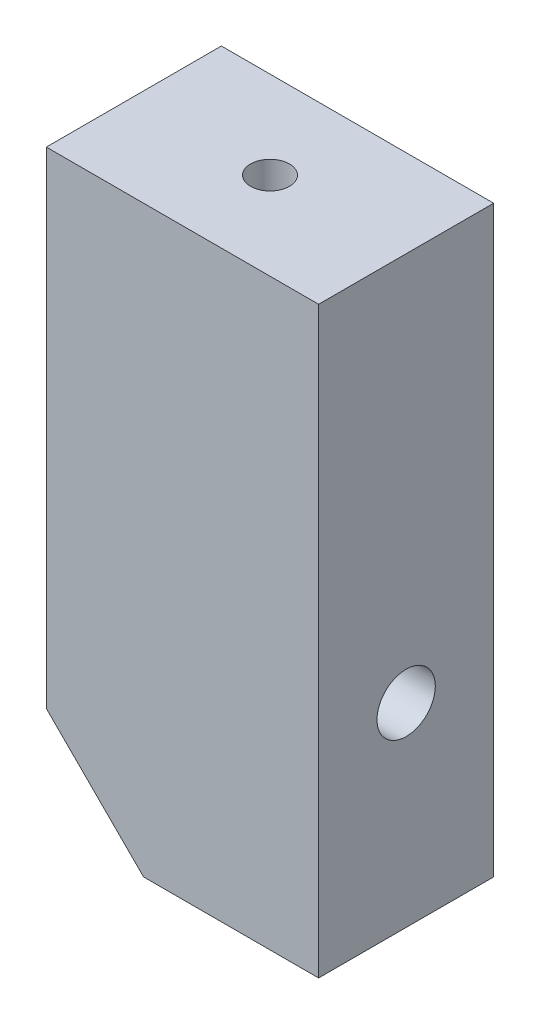
ISO-10303-21;
HEADER;
FILE_DESCRIPTION(('STEP AP214'),'2;1');
FILE_NAME('part.step','',(''),(''),'','','');
FILE_SCHEMA(('AUTOMOTIVE_DESIGN { 1 0 10303 214 1 1 1 1 }'));
ENDSEC;
DATA;
#1=APPLICATION_CONTEXT('core data for automotive mechanical design processes');
#2=APPLICATION_PROTOCOL_DEFINITION('international standard','automotive_design',2000,#1);
#3=PRODUCT_CONTEXT('',#1,'mechanical');
#4=PRODUCT('Part','Part','',(#3));
#5=PRODUCT_RELATED_PRODUCT_CATEGORY('part','',(#4));
#6=PRODUCT_DEFINITION_FORMATION('','',#4);
#7=PRODUCT_DEFINITION_CONTEXT('part definition',#1,'design');
#8=PRODUCT_DEFINITION('design','',#6,#7);
#9=PRODUCT_DEFINITION_SHAPE('','',#8);
#10=(LENGTH_UNIT() NAMED_UNIT(*) SI_UNIT(.MILLI.,.METRE.));
#11=(NAMED_UNIT(*) PLANE_ANGLE_UNIT() SI_UNIT($,.RADIAN.));
#12=(NAMED_UNIT(*) SI_UNIT($,.STERADIAN.) SOLID_ANGLE_UNIT());
#13=UNCERTAINTY_MEASURE_WITH_UNIT(LENGTH_MEASURE(1.E-05),#10,'distance_accuracy_value','');
#14=(GEOMETRIC_REPRESENTATION_CONTEXT(3) GLOBAL_UNCERTAINTY_ASSIGNED_CONTEXT((#13)) GLOBAL_UNIT_ASSIGNED_CONTEXT((#10,
#11,#12)) REPRESENTATION_CONTEXT('',''));
#15=CARTESIAN_POINT('',(0.,0.,0.));
#16=DIRECTION('',(0.,0.,1.));
#17=DIRECTION('',(1.,0.,0.));
#18=AXIS2_PLACEMENT_3D('',#15,#16,#17);
#19=CARTESIAN_POINT('',(14.,30.,18.));
#20=DIRECTION('',(-1.,0.,0.));
#21=DIRECTION('',(0.,-1.,0.));
#22=AXIS2_PLACEMENT_3D('',#19,#20,#21);
#23=PLANE('',#22);
#24=CARTESIAN_POINT('',(14.,-10.0000000000001,9.00000000000004));
#25=DIRECTION('',(1.,0.,0.));
#26=DIRECTION('',(0.,0.,-1.));
#27=AXIS2_PLACEMENT_3D('',#24,#25,#26);
#28=CIRCLE('',#27,3.);
#29=CARTESIAN_POINT('',(14.,-10.0000000000001,6.00000000000004));
#30=VERTEX_POINT('',#29);
#31=EDGE_CURVE('E179',#30,#30,#28,.T.);
#32=ORIENTED_EDGE('',*,*,#31,.F.);
#33=EDGE_LOOP('',(#32));
#34=FACE_BOUND('',#33,.T.);
#35=DIRECTION('',(0.,1.,0.));
#36=VECTOR('',#35,1.);
#37=CARTESIAN_POINT('',(14.,30.,0.));
#38=LINE('',#37,#36);
#39=CARTESIAN_POINT('',(14.,-30.,0.));
#40=VERTEX_POINT('',#39);
#41=CARTESIAN_POINT('',(14.,30.,0.));
#42=VERTEX_POINT('',#41);
#43=EDGE_CURVE('E90',#40,#42,#38,.T.);
#44=ORIENTED_EDGE('',*,*,#43,.T.);
#45=DIRECTION('',(0.,0.,-1.));
#46=VECTOR('',#45,1.);
#47=CARTESIAN_POINT('',(14.,30.,18.));
#48=LINE('',#47,#46);
#49=CARTESIAN_POINT('',(14.,30.,18.));
#50=VERTEX_POINT('',#49);
#51=EDGE_CURVE('E121',#50,#42,#48,.T.);
#52=ORIENTED_EDGE('',*,*,#51,.F.);
#53=DIRECTION('',(0.,1.,0.));
#54=VECTOR('',#53,1.);
#55=CARTESIAN_POINT('',(14.,30.,18.));
#56=LINE('',#55,#54);
#57=CARTESIAN_POINT('',(14.,-30.,18.));
#58=VERTEX_POINT('',#57);
#59=EDGE_CURVE('E101',#58,#50,#56,.T.);
#60=ORIENTED_EDGE('',*,*,#59,.F.);
#61=DIRECTION('',(0.,0.,-1.));
#62=VECTOR('',#61,1.);
#63=CARTESIAN_POINT('',(14.,-30.,18.));
#64=LINE('',#63,#62);
#65=EDGE_CURVE('E110',#58,#40,#64,.T.);
#66=ORIENTED_EDGE('',*,*,#65,.T.);
#67=EDGE_LOOP('',(#44,#52,#60,#66));
#68=FACE_BOUND('',#67,.T.);
#69=ADVANCED_FACE('F33',(#34,#68),#23,.F.);
#70=CARTESIAN_POINT('',(-14.,30.,18.));
#71=DIRECTION('',(0.,-1.,0.));
#72=DIRECTION('',(0.,0.,-1.));
#73=AXIS2_PLACEMENT_3D('',#70,#71,#72);
#74=PLANE('',#73);
#75=CARTESIAN_POINT('',(0.,30.,8.99999999999997));
#76=DIRECTION('',(0.,1.,0.));
#77=DIRECTION('',(0.,0.,1.));
#78=AXIS2_PLACEMENT_3D('',#75,#76,#77);
#79=CIRCLE('',#78,1.99999999999999);
#80=CARTESIAN_POINT('',(0.,30.,11.));
#81=VERTEX_POINT('',#80);
#82=EDGE_CURVE('E91',#81,#81,#79,.T.);
#83=ORIENTED_EDGE('',*,*,#82,.F.);
#84=EDGE_LOOP('',(#83));
#85=FACE_BOUND('',#84,.T.);
#86=DIRECTION('',(-1.,0.,0.));
#87=VECTOR('',#86,1.);
#88=CARTESIAN_POINT('',(-14.,30.,0.));
#89=LINE('',#88,#87);
#90=CARTESIAN_POINT('',(-14.,30.,0.));
#91=VERTEX_POINT('',#90);
#92=EDGE_CURVE('E94',#42,#91,#89,.T.);
#93=ORIENTED_EDGE('',*,*,#92,.T.);
#94=DIRECTION('',(0.,0.,-1.));
#95=VECTOR('',#94,1.);
#96=CARTESIAN_POINT('',(-14.,30.,18.));
#97=LINE('',#96,#95);
#98=CARTESIAN_POINT('',(-14.,30.,18.));
#99=VERTEX_POINT('',#98);
#100=EDGE_CURVE('E118',#99,#91,#97,.T.);
#101=ORIENTED_EDGE('',*,*,#100,.F.);
#102=DIRECTION('',(-1.,0.,0.));
#103=VECTOR('',#102,1.);
#104=CARTESIAN_POINT('',(-14.,30.,18.));
#105=LINE('',#104,#103);
#106=EDGE_CURVE('E104',#50,#99,#105,.T.);
#107=ORIENTED_EDGE('',*,*,#106,.F.);
#108=ORIENTED_EDGE('',*,*,#51,.T.);
#109=EDGE_LOOP('',(#93,#101,#107,#108));
#110=FACE_BOUND('',#109,.T.);
#111=ADVANCED_FACE('F148',(#85,#110),#74,.F.);
#112=CARTESIAN_POINT('',(-14.,30.,18.));
#113=DIRECTION('',(1.,0.,0.));
#114=DIRECTION('',(0.,1.,0.));
#115=AXIS2_PLACEMENT_3D('',#112,#113,#114);
#116=PLANE('',#115);
#117=DIRECTION('',(0.,-1.,0.));
#118=VECTOR('',#117,1.);
#119=CARTESIAN_POINT('',(-14.,30.,0.));
#120=LINE('',#119,#118);
#121=CARTESIAN_POINT('',(-14.,-20.,0.));
#122=VERTEX_POINT('',#121);
#123=EDGE_CURVE('E113',#91,#122,#120,.T.);
#124=ORIENTED_EDGE('',*,*,#123,.T.);
#125=DIRECTION('',(0.,0.,1.));
#126=VECTOR('',#125,1.);
#127=CARTESIAN_POINT('',(-14.,-20.,18.));
#128=LINE('',#127,#126);
#129=CARTESIAN_POINT('',(-14.,-20.,18.));
#130=VERTEX_POINT('',#129);
#131=EDGE_CURVE('E41',#122,#130,#128,.T.);
#132=ORIENTED_EDGE('',*,*,#131,.T.);
#133=DIRECTION('',(0.,-1.,0.));
#134=VECTOR('',#133,1.);
#135=CARTESIAN_POINT('',(-14.,30.,18.));
#136=LINE('',#135,#134);
#137=EDGE_CURVE('E107',#99,#130,#136,.T.);
#138=ORIENTED_EDGE('',*,*,#137,.F.);
#139=ORIENTED_EDGE('',*,*,#100,.T.);
#140=EDGE_LOOP('',(#124,#132,#138,#139));
#141=FACE_BOUND('',#140,.T.);
#142=ADVANCED_FACE('F153',(#141),#116,.F.);
#143=CARTESIAN_POINT('',(-14.,-30.,18.));
#144=DIRECTION('',(0.,1.,0.));
#145=DIRECTION('',(0.,0.,1.));
#146=AXIS2_PLACEMENT_3D('',#143,#144,#145);
#147=PLANE('',#146);
#148=DIRECTION('',(1.,0.,0.));
#149=VECTOR('',#148,1.);
#150=CARTESIAN_POINT('',(-14.,-30.,18.));
#151=LINE('',#150,#149);
#152=CARTESIAN_POINT('',(-4.,-30.,18.));
#153=VERTEX_POINT('',#152);
#154=EDGE_CURVE('E109',#153,#58,#151,.T.);
#155=ORIENTED_EDGE('',*,*,#154,.F.);
#156=DIRECTION('',(0.,0.,-1.));
#157=VECTOR('',#156,1.);
#158=CARTESIAN_POINT('',(-4.,-30.,18.));
#159=LINE('',#158,#157);
#160=CARTESIAN_POINT('',(-4.,-30.,0.));
#161=VERTEX_POINT('',#160);
#162=EDGE_CURVE('E124',#153,#161,#159,.T.);
#163=ORIENTED_EDGE('',*,*,#162,.T.);
#164=DIRECTION('',(1.,0.,0.));
#165=VECTOR('',#164,1.);
#166=CARTESIAN_POINT('',(-14.,-30.,0.));
#167=LINE('',#166,#165);
#168=EDGE_CURVE('E105',#161,#40,#167,.T.);
#169=ORIENTED_EDGE('',*,*,#168,.T.);
#170=ORIENTED_EDGE('',*,*,#65,.F.);
#171=EDGE_LOOP('',(#155,#163,#169,#170));
#172=FACE_BOUND('',#171,.T.);
#173=ADVANCED_FACE('F130',(#172),#147,.F.);
#174=CARTESIAN_POINT('',(0.,0.,18.));
#175=DIRECTION('',(0.,0.,1.));
#176=DIRECTION('',(1.,0.,0.));
#177=AXIS2_PLACEMENT_3D('',#174,#175,#176);
#178=PLANE('',#177);
#179=ORIENTED_EDGE('',*,*,#137,.T.);
#180=DIRECTION('',(-0.707106781186546,0.707106781186549,0.));
#181=VECTOR('',#180,1.);
#182=CARTESIAN_POINT('',(-17.,-17.,18.));
#183=LINE('',#182,#181);
#184=EDGE_CURVE('E11',#130,#153,#183,.F.);
#185=ORIENTED_EDGE('',*,*,#184,.T.);
#186=ORIENTED_EDGE('',*,*,#154,.T.);
#187=ORIENTED_EDGE('',*,*,#59,.T.);
#188=ORIENTED_EDGE('',*,*,#106,.T.);
#189=EDGE_LOOP('',(#179,#185,#186,#187,#188));
#190=FACE_BOUND('',#189,.T.);
#191=ADVANCED_FACE('F140',(#190),#178,.T.);
#192=CARTESIAN_POINT('',(0.,0.,0.));
#193=DIRECTION('',(0.,0.,1.));
#194=DIRECTION('',(1.,0.,0.));
#195=AXIS2_PLACEMENT_3D('',#192,#193,#194);
#196=PLANE('',#195);
#197=ORIENTED_EDGE('',*,*,#168,.F.);
#198=DIRECTION('',(0.707106781186546,-0.707106781186549,0.));
#199=VECTOR('',#198,1.);
#200=CARTESIAN_POINT('',(-4.,-30.,0.));
#201=LINE('',#200,#199);
#202=EDGE_CURVE('E55',#161,#122,#201,.F.);
#203=ORIENTED_EDGE('',*,*,#202,.T.);
#204=ORIENTED_EDGE('',*,*,#123,.F.);
#205=ORIENTED_EDGE('',*,*,#92,.F.);
#206=ORIENTED_EDGE('',*,*,#43,.F.);
#207=EDGE_LOOP('',(#197,#203,#204,#205,#206));
#208=FACE_BOUND('',#207,.T.);
#209=ADVANCED_FACE('F135',(#208),#196,.F.);
#210=CARTESIAN_POINT('',(-4.,-30.,18.));
#211=DIRECTION('',(0.707106781186549,0.707106781186546,0.));
#212=DIRECTION('',(0.,0.,-1.));
#213=AXIS2_PLACEMENT_3D('',#210,#211,#212);
#214=PLANE('',#213);
#215=ORIENTED_EDGE('',*,*,#184,.F.);
#216=ORIENTED_EDGE('',*,*,#131,.F.);
#217=ORIENTED_EDGE('',*,*,#202,.F.);
#218=ORIENTED_EDGE('',*,*,#162,.F.);
#219=EDGE_LOOP('',(#215,#216,#217,#218));
#220=FACE_BOUND('',#219,.T.);
#221=ADVANCED_FACE('F35',(#220),#214,.F.);
#222=CARTESIAN_POINT('',(0.,0.,8.99999999999997));
#223=DIRECTION('',(0.,1.,0.));
#224=DIRECTION('',(0.,0.,1.));
#225=AXIS2_PLACEMENT_3D('',#222,#223,#224);
#226=CONICAL_SURFACE('',#225,1.99999999999999,1.02974425867665);
#227=CARTESIAN_POINT('',(0.,-1.20172123805512,8.99999999999997));
#228=VERTEX_POINT('',#227);
#229=VERTEX_LOOP('',#228);
#230=FACE_BOUND('',#229,.T.);
#231=CARTESIAN_POINT('',(0.,0.,8.99999999999997));
#232=DIRECTION('',(0.,1.,0.));
#233=DIRECTION('',(0.,0.,1.));
#234=AXIS2_PLACEMENT_3D('',#231,#232,#233);
#235=CIRCLE('',#234,1.99999999999999);
#236=CARTESIAN_POINT('',(0.,0.,11.));
#237=VERTEX_POINT('',#236);
#238=EDGE_CURVE('E88',#237,#237,#235,.T.);
#239=ORIENTED_EDGE('',*,*,#238,.T.);
#240=EDGE_LOOP('',(#239));
#241=FACE_BOUND('',#240,.T.);
#242=ADVANCED_FACE('F81',(#230,#241),#226,.F.);
#243=CARTESIAN_POINT('',(0.,30.,8.99999999999997));
#244=DIRECTION('',(0.,1.,0.));
#245=DIRECTION('',(0.,0.,1.));
#246=AXIS2_PLACEMENT_3D('',#243,#244,#245);
#247=CYLINDRICAL_SURFACE('',#246,1.99999999999999);
#248=ORIENTED_EDGE('',*,*,#238,.F.);
#249=EDGE_LOOP('',(#248));
#250=FACE_BOUND('',#249,.T.);
#251=ORIENTED_EDGE('',*,*,#82,.T.);
#252=EDGE_LOOP('',(#251));
#253=FACE_BOUND('',#252,.T.);
#254=ADVANCED_FACE('F84',(#250,#253),#247,.F.);
#255=CARTESIAN_POINT('',(-4.,-10.0000000000001,9.00000000000004));
#256=DIRECTION('',(-1.,0.,0.));
#257=DIRECTION('',(0.,0.,1.));
#258=AXIS2_PLACEMENT_3D('',#255,#256,#257);
#259=PLANE('',#258);
#260=CARTESIAN_POINT('',(-4.,-10.0000000000001,9.00000000000004));
#261=DIRECTION('',(1.,0.,0.));
#262=DIRECTION('',(0.,0.,-1.));
#263=AXIS2_PLACEMENT_3D('',#260,#261,#262);
#264=CIRCLE('',#263,2.99999999999999);
#265=CARTESIAN_POINT('',(-4.,-10.0000000000001,6.00000000000004));
#266=VERTEX_POINT('',#265);
#267=EDGE_CURVE('E97',#266,#266,#264,.T.);
#268=ORIENTED_EDGE('',*,*,#267,.T.);
#269=EDGE_LOOP('',(#268));
#270=FACE_BOUND('',#269,.T.);
#271=ADVANCED_FACE('F166',(#270),#259,.F.);
#272=CARTESIAN_POINT('',(14.,-10.0000000000001,9.00000000000004));
#273=DIRECTION('',(1.,0.,0.));
#274=DIRECTION('',(0.,0.,-1.));
#275=AXIS2_PLACEMENT_3D('',#272,#273,#274);
#276=CYLINDRICAL_SURFACE('',#275,3.);
#277=ORIENTED_EDGE('',*,*,#267,.F.);
#278=EDGE_LOOP('',(#277));
#279=FACE_BOUND('',#278,.T.);
#280=ORIENTED_EDGE('',*,*,#31,.T.);
#281=EDGE_LOOP('',(#280));
#282=FACE_BOUND('',#281,.T.);
#283=ADVANCED_FACE('F169',(#279,#282),#276,.F.);
#284=CLOSED_SHELL('',(#69,#111,#142,#173,#191,#209,#221,#242,#254,#271,#283));
#285=MANIFOLD_SOLID_BREP('B2',#284);
#286=ADVANCED_BREP_SHAPE_REPRESENTATION('',(#18,#285),#14);
#287=SHAPE_DEFINITION_REPRESENTATION(#9,#286);
ENDSEC;
END-ISO-10303-21;
